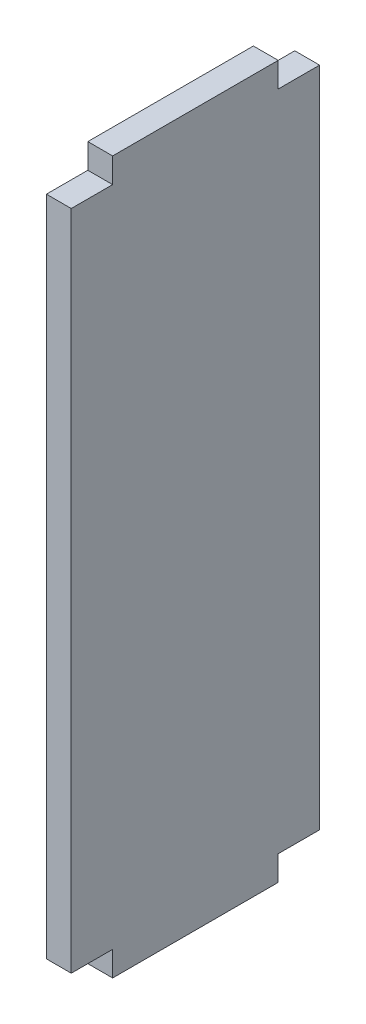
ISO-10303-21;
HEADER;
FILE_DESCRIPTION(('STEP AP214'),'2;1');
FILE_NAME('part.step','',(''),(''),'','','');
FILE_SCHEMA(('AUTOMOTIVE_DESIGN { 1 0 10303 214 1 1 1 1 }'));
ENDSEC;
DATA;
#1=APPLICATION_CONTEXT('core data for automotive mechanical design processes');
#2=APPLICATION_PROTOCOL_DEFINITION('international standard','automotive_design',2000,#1);
#3=PRODUCT_CONTEXT('',#1,'mechanical');
#4=PRODUCT('Part','Part','',(#3));
#5=PRODUCT_RELATED_PRODUCT_CATEGORY('part','',(#4));
#6=PRODUCT_DEFINITION_FORMATION('','',#4);
#7=PRODUCT_DEFINITION_CONTEXT('part definition',#1,'design');
#8=PRODUCT_DEFINITION('design','',#6,#7);
#9=PRODUCT_DEFINITION_SHAPE('','',#8);
#10=(LENGTH_UNIT() NAMED_UNIT(*) SI_UNIT(.MILLI.,.METRE.));
#11=(NAMED_UNIT(*) PLANE_ANGLE_UNIT() SI_UNIT($,.RADIAN.));
#12=(NAMED_UNIT(*) SI_UNIT($,.STERADIAN.) SOLID_ANGLE_UNIT());
#13=UNCERTAINTY_MEASURE_WITH_UNIT(LENGTH_MEASURE(1.E-05),#10,'distance_accuracy_value','');
#14=(GEOMETRIC_REPRESENTATION_CONTEXT(3) GLOBAL_UNCERTAINTY_ASSIGNED_CONTEXT((#13)) GLOBAL_UNIT_ASSIGNED_CONTEXT((#10,
#11,#12)) REPRESENTATION_CONTEXT('',''));
#15=CARTESIAN_POINT('',(0.,0.,0.));
#16=DIRECTION('',(0.,0.,1.));
#17=DIRECTION('',(1.,0.,0.));
#18=AXIS2_PLACEMENT_3D('',#15,#16,#17);
#19=CARTESIAN_POINT('',(-3.,0.,25.));
#20=DIRECTION('',(0.,1.,0.));
#21=DIRECTION('',(0.,0.,1.));
#22=AXIS2_PLACEMENT_3D('',#19,#20,#21);
#23=PLANE('',#22);
#24=DIRECTION('',(0.,0.,1.));
#25=VECTOR('',#24,1.);
#26=CARTESIAN_POINT('',(0.,0.,25.));
#27=LINE('',#26,#25);
#28=CARTESIAN_POINT('',(0.,0.,25.));
#29=VERTEX_POINT('',#28);
#30=CARTESIAN_POINT('',(0.,0.,30.));
#31=VERTEX_POINT('',#30);
#32=EDGE_CURVE('E142',#29,#31,#27,.T.);
#33=ORIENTED_EDGE('',*,*,#32,.T.);
#34=DIRECTION('',(1.,0.,0.));
#35=VECTOR('',#34,1.);
#36=CARTESIAN_POINT('',(-3.,0.,30.));
#37=LINE('',#36,#35);
#38=CARTESIAN_POINT('',(-3.,0.,30.));
#39=VERTEX_POINT('',#38);
#40=EDGE_CURVE('E10',#39,#31,#37,.T.);
#41=ORIENTED_EDGE('',*,*,#40,.F.);
#42=DIRECTION('',(0.,0.,1.));
#43=VECTOR('',#42,1.);
#44=CARTESIAN_POINT('',(-3.,0.,25.));
#45=LINE('',#44,#43);
#46=CARTESIAN_POINT('',(-3.,0.,25.));
#47=VERTEX_POINT('',#46);
#48=EDGE_CURVE('E136',#47,#39,#45,.T.);
#49=ORIENTED_EDGE('',*,*,#48,.F.);
#50=DIRECTION('',(1.,0.,0.));
#51=VECTOR('',#50,1.);
#52=CARTESIAN_POINT('',(-3.,0.,25.));
#53=LINE('',#52,#51);
#54=EDGE_CURVE('E132',#47,#29,#53,.T.);
#55=ORIENTED_EDGE('',*,*,#54,.T.);
#56=EDGE_LOOP('',(#33,#41,#49,#55));
#57=FACE_BOUND('',#56,.T.);
#58=ADVANCED_FACE('F16',(#57),#23,.F.);
#59=CARTESIAN_POINT('',(-3.,0.,30.));
#60=DIRECTION('',(0.,0.,-1.));
#61=DIRECTION('',(-1.,0.,0.));
#62=AXIS2_PLACEMENT_3D('',#59,#60,#61);
#63=PLANE('',#62);
#64=DIRECTION('',(0.,1.,0.));
#65=VECTOR('',#64,1.);
#66=CARTESIAN_POINT('',(0.,0.,30.));
#67=LINE('',#66,#65);
#68=CARTESIAN_POINT('',(0.,80.,30.));
#69=VERTEX_POINT('',#68);
#70=EDGE_CURVE('E138',#31,#69,#67,.T.);
#71=ORIENTED_EDGE('',*,*,#70,.T.);
#72=DIRECTION('',(1.,0.,0.));
#73=VECTOR('',#72,1.);
#74=CARTESIAN_POINT('',(-3.,80.,30.));
#75=LINE('',#74,#73);
#76=CARTESIAN_POINT('',(-3.,80.,30.));
#77=VERTEX_POINT('',#76);
#78=EDGE_CURVE('E24',#77,#69,#75,.T.);
#79=ORIENTED_EDGE('',*,*,#78,.F.);
#80=DIRECTION('',(0.,1.,0.));
#81=VECTOR('',#80,1.);
#82=CARTESIAN_POINT('',(-3.,0.,30.));
#83=LINE('',#82,#81);
#84=EDGE_CURVE('E87',#39,#77,#83,.T.);
#85=ORIENTED_EDGE('',*,*,#84,.F.);
#86=ORIENTED_EDGE('',*,*,#40,.T.);
#87=EDGE_LOOP('',(#71,#79,#85,#86));
#88=FACE_BOUND('',#87,.T.);
#89=ADVANCED_FACE('F250',(#88),#63,.F.);
#90=CARTESIAN_POINT('',(-3.,80.,30.));
#91=DIRECTION('',(0.,-1.,0.));
#92=DIRECTION('',(0.,0.,-1.));
#93=AXIS2_PLACEMENT_3D('',#90,#91,#92);
#94=PLANE('',#93);
#95=DIRECTION('',(0.,0.,-1.));
#96=VECTOR('',#95,1.);
#97=CARTESIAN_POINT('',(0.,80.,30.));
#98=LINE('',#97,#96);
#99=CARTESIAN_POINT('',(0.,80.,25.));
#100=VERTEX_POINT('',#99);
#101=EDGE_CURVE('E141',#69,#100,#98,.T.);
#102=ORIENTED_EDGE('',*,*,#101,.T.);
#103=DIRECTION('',(1.,0.,0.));
#104=VECTOR('',#103,1.);
#105=CARTESIAN_POINT('',(-3.,80.,25.));
#106=LINE('',#105,#104);
#107=CARTESIAN_POINT('',(-3.,80.,25.));
#108=VERTEX_POINT('',#107);
#109=EDGE_CURVE('E190',#108,#100,#106,.T.);
#110=ORIENTED_EDGE('',*,*,#109,.F.);
#111=DIRECTION('',(0.,0.,-1.));
#112=VECTOR('',#111,1.);
#113=CARTESIAN_POINT('',(-3.,80.,30.));
#114=LINE('',#113,#112);
#115=EDGE_CURVE('E198',#77,#108,#114,.T.);
#116=ORIENTED_EDGE('',*,*,#115,.F.);
#117=ORIENTED_EDGE('',*,*,#78,.T.);
#118=EDGE_LOOP('',(#102,#110,#116,#117));
#119=FACE_BOUND('',#118,.T.);
#120=ADVANCED_FACE('F196',(#119),#94,.F.);
#121=CARTESIAN_POINT('',(-3.,80.,25.));
#122=DIRECTION('',(0.,0.,-1.));
#123=DIRECTION('',(-1.,0.,0.));
#124=AXIS2_PLACEMENT_3D('',#121,#122,#123);
#125=PLANE('',#124);
#126=DIRECTION('',(0.,1.,0.));
#127=VECTOR('',#126,1.);
#128=CARTESIAN_POINT('',(0.,80.,25.));
#129=LINE('',#128,#127);
#130=CARTESIAN_POINT('',(0.,83.,25.));
#131=VERTEX_POINT('',#130);
#132=EDGE_CURVE('E145',#100,#131,#129,.T.);
#133=ORIENTED_EDGE('',*,*,#132,.T.);
#134=DIRECTION('',(1.,0.,0.));
#135=VECTOR('',#134,1.);
#136=CARTESIAN_POINT('',(-2.99999999999999,83.,25.));
#137=LINE('',#136,#135);
#138=CARTESIAN_POINT('',(-2.99999999999999,83.,25.));
#139=VERTEX_POINT('',#138);
#140=EDGE_CURVE('E187',#139,#131,#137,.T.);
#141=ORIENTED_EDGE('',*,*,#140,.F.);
#142=DIRECTION('',(0.,1.,0.));
#143=VECTOR('',#142,1.);
#144=CARTESIAN_POINT('',(-3.,80.,25.));
#145=LINE('',#144,#143);
#146=EDGE_CURVE('E216',#108,#139,#145,.T.);
#147=ORIENTED_EDGE('',*,*,#146,.F.);
#148=ORIENTED_EDGE('',*,*,#109,.T.);
#149=EDGE_LOOP('',(#133,#141,#147,#148));
#150=FACE_BOUND('',#149,.T.);
#151=ADVANCED_FACE('F207',(#150),#125,.F.);
#152=CARTESIAN_POINT('',(-2.99999999999999,83.,25.));
#153=DIRECTION('',(0.,-1.,0.));
#154=DIRECTION('',(0.,0.,-1.));
#155=AXIS2_PLACEMENT_3D('',#152,#153,#154);
#156=PLANE('',#155);
#157=DIRECTION('',(0.,0.,-1.));
#158=VECTOR('',#157,1.);
#159=CARTESIAN_POINT('',(0.,83.,25.));
#160=LINE('',#159,#158);
#161=CARTESIAN_POINT('',(0.,83.,5.00000000000002));
#162=VERTEX_POINT('',#161);
#163=EDGE_CURVE('E148',#131,#162,#160,.T.);
#164=ORIENTED_EDGE('',*,*,#163,.T.);
#165=DIRECTION('',(1.,0.,0.));
#166=VECTOR('',#165,1.);
#167=CARTESIAN_POINT('',(-2.99999999999999,83.,5.00000000000002));
#168=LINE('',#167,#166);
#169=CARTESIAN_POINT('',(-2.99999999999999,83.,5.00000000000002));
#170=VERTEX_POINT('',#169);
#171=EDGE_CURVE('E184',#170,#162,#168,.T.);
#172=ORIENTED_EDGE('',*,*,#171,.F.);
#173=DIRECTION('',(0.,0.,-1.));
#174=VECTOR('',#173,1.);
#175=CARTESIAN_POINT('',(-2.99999999999999,83.,25.));
#176=LINE('',#175,#174);
#177=EDGE_CURVE('E213',#139,#170,#176,.T.);
#178=ORIENTED_EDGE('',*,*,#177,.F.);
#179=ORIENTED_EDGE('',*,*,#140,.T.);
#180=EDGE_LOOP('',(#164,#172,#178,#179));
#181=FACE_BOUND('',#180,.T.);
#182=ADVANCED_FACE('F211',(#181),#156,.F.);
#183=CARTESIAN_POINT('',(-2.99999999999999,83.,5.00000000000002));
#184=DIRECTION('',(0.,0.,1.));
#185=DIRECTION('',(0.,-1.,0.));
#186=AXIS2_PLACEMENT_3D('',#183,#184,#185);
#187=PLANE('',#186);
#188=DIRECTION('',(0.,-1.,0.));
#189=VECTOR('',#188,1.);
#190=CARTESIAN_POINT('',(0.,83.,5.00000000000002));
#191=LINE('',#190,#189);
#192=CARTESIAN_POINT('',(0.,80.,5.00000000000002));
#193=VERTEX_POINT('',#192);
#194=EDGE_CURVE('E151',#162,#193,#191,.T.);
#195=ORIENTED_EDGE('',*,*,#194,.T.);
#196=DIRECTION('',(1.,0.,0.));
#197=VECTOR('',#196,1.);
#198=CARTESIAN_POINT('',(-3.,80.,5.00000000000002));
#199=LINE('',#198,#197);
#200=CARTESIAN_POINT('',(-3.,80.,5.00000000000002));
#201=VERTEX_POINT('',#200);
#202=EDGE_CURVE('E181',#201,#193,#199,.T.);
#203=ORIENTED_EDGE('',*,*,#202,.F.);
#204=DIRECTION('',(0.,-1.,0.));
#205=VECTOR('',#204,1.);
#206=CARTESIAN_POINT('',(-2.99999999999999,83.,5.00000000000002));
#207=LINE('',#206,#205);
#208=EDGE_CURVE('E215',#170,#201,#207,.T.);
#209=ORIENTED_EDGE('',*,*,#208,.F.);
#210=ORIENTED_EDGE('',*,*,#171,.T.);
#211=EDGE_LOOP('',(#195,#203,#209,#210));
#212=FACE_BOUND('',#211,.T.);
#213=ADVANCED_FACE('F263',(#212),#187,.F.);
#214=CARTESIAN_POINT('',(-3.,80.,5.00000000000002));
#215=DIRECTION('',(0.,-1.,0.));
#216=DIRECTION('',(0.,0.,-1.));
#217=AXIS2_PLACEMENT_3D('',#214,#215,#216);
#218=PLANE('',#217);
#219=DIRECTION('',(0.,0.,-1.));
#220=VECTOR('',#219,1.);
#221=CARTESIAN_POINT('',(0.,80.,5.00000000000002));
#222=LINE('',#221,#220);
#223=CARTESIAN_POINT('',(0.,80.,0.));
#224=VERTEX_POINT('',#223);
#225=EDGE_CURVE('E154',#193,#224,#222,.T.);
#226=ORIENTED_EDGE('',*,*,#225,.T.);
#227=DIRECTION('',(1.,0.,0.));
#228=VECTOR('',#227,1.);
#229=CARTESIAN_POINT('',(-3.,80.,0.));
#230=LINE('',#229,#228);
#231=CARTESIAN_POINT('',(-3.,80.,0.));
#232=VERTEX_POINT('',#231);
#233=EDGE_CURVE('E178',#232,#224,#230,.T.);
#234=ORIENTED_EDGE('',*,*,#233,.F.);
#235=DIRECTION('',(0.,0.,-1.));
#236=VECTOR('',#235,1.);
#237=CARTESIAN_POINT('',(-3.,80.,5.00000000000002));
#238=LINE('',#237,#236);
#239=EDGE_CURVE('E218',#201,#232,#238,.T.);
#240=ORIENTED_EDGE('',*,*,#239,.F.);
#241=ORIENTED_EDGE('',*,*,#202,.T.);
#242=EDGE_LOOP('',(#226,#234,#240,#241));
#243=FACE_BOUND('',#242,.T.);
#244=ADVANCED_FACE('F266',(#243),#218,.F.);
#245=CARTESIAN_POINT('',(-3.,80.,0.));
#246=DIRECTION('',(0.,0.,1.));
#247=DIRECTION('',(0.,-1.,0.));
#248=AXIS2_PLACEMENT_3D('',#245,#246,#247);
#249=PLANE('',#248);
#250=DIRECTION('',(0.,-1.,0.));
#251=VECTOR('',#250,1.);
#252=CARTESIAN_POINT('',(0.,80.,0.));
#253=LINE('',#252,#251);
#254=CARTESIAN_POINT('',(0.,0.,0.));
#255=VERTEX_POINT('',#254);
#256=EDGE_CURVE('E157',#224,#255,#253,.T.);
#257=ORIENTED_EDGE('',*,*,#256,.T.);
#258=DIRECTION('',(1.,0.,0.));
#259=VECTOR('',#258,1.);
#260=CARTESIAN_POINT('',(-3.,0.,0.));
#261=LINE('',#260,#259);
#262=CARTESIAN_POINT('',(-3.,0.,0.));
#263=VERTEX_POINT('',#262);
#264=EDGE_CURVE('E175',#263,#255,#261,.T.);
#265=ORIENTED_EDGE('',*,*,#264,.F.);
#266=DIRECTION('',(0.,-1.,0.));
#267=VECTOR('',#266,1.);
#268=CARTESIAN_POINT('',(-3.,80.,0.));
#269=LINE('',#268,#267);
#270=EDGE_CURVE('E224',#232,#263,#269,.T.);
#271=ORIENTED_EDGE('',*,*,#270,.F.);
#272=ORIENTED_EDGE('',*,*,#233,.T.);
#273=EDGE_LOOP('',(#257,#265,#271,#272));
#274=FACE_BOUND('',#273,.T.);
#275=ADVANCED_FACE('F230',(#274),#249,.F.);
#276=CARTESIAN_POINT('',(-3.,0.,0.));
#277=DIRECTION('',(0.,1.,0.));
#278=DIRECTION('',(0.,0.,1.));
#279=AXIS2_PLACEMENT_3D('',#276,#277,#278);
#280=PLANE('',#279);
#281=DIRECTION('',(0.,0.,1.));
#282=VECTOR('',#281,1.);
#283=CARTESIAN_POINT('',(0.,0.,0.));
#284=LINE('',#283,#282);
#285=CARTESIAN_POINT('',(0.,0.,5.));
#286=VERTEX_POINT('',#285);
#287=EDGE_CURVE('E160',#255,#286,#284,.T.);
#288=ORIENTED_EDGE('',*,*,#287,.T.);
#289=DIRECTION('',(1.,0.,0.));
#290=VECTOR('',#289,1.);
#291=CARTESIAN_POINT('',(-3.,0.,5.));
#292=LINE('',#291,#290);
#293=CARTESIAN_POINT('',(-3.,0.,5.));
#294=VERTEX_POINT('',#293);
#295=EDGE_CURVE('E127',#294,#286,#292,.T.);
#296=ORIENTED_EDGE('',*,*,#295,.F.);
#297=DIRECTION('',(0.,0.,1.));
#298=VECTOR('',#297,1.);
#299=CARTESIAN_POINT('',(-3.,0.,0.));
#300=LINE('',#299,#298);
#301=EDGE_CURVE('E118',#263,#294,#300,.T.);
#302=ORIENTED_EDGE('',*,*,#301,.F.);
#303=ORIENTED_EDGE('',*,*,#264,.T.);
#304=EDGE_LOOP('',(#288,#296,#302,#303));
#305=FACE_BOUND('',#304,.T.);
#306=ADVANCED_FACE('F234',(#305),#280,.F.);
#307=CARTESIAN_POINT('',(-3.,0.,5.));
#308=DIRECTION('',(0.,0.,1.));
#309=DIRECTION('',(1.,0.,0.));
#310=AXIS2_PLACEMENT_3D('',#307,#308,#309);
#311=PLANE('',#310);
#312=DIRECTION('',(0.,-1.,0.));
#313=VECTOR('',#312,1.);
#314=CARTESIAN_POINT('',(0.,0.,5.));
#315=LINE('',#314,#313);
#316=CARTESIAN_POINT('',(0.,-3.,5.));
#317=VERTEX_POINT('',#316);
#318=EDGE_CURVE('E126',#286,#317,#315,.T.);
#319=ORIENTED_EDGE('',*,*,#318,.T.);
#320=DIRECTION('',(1.,0.,0.));
#321=VECTOR('',#320,1.);
#322=CARTESIAN_POINT('',(-3.,-3.,5.));
#323=LINE('',#322,#321);
#324=CARTESIAN_POINT('',(-3.,-3.,5.));
#325=VERTEX_POINT('',#324);
#326=EDGE_CURVE('E123',#325,#317,#323,.T.);
#327=ORIENTED_EDGE('',*,*,#326,.F.);
#328=DIRECTION('',(0.,-1.,0.));
#329=VECTOR('',#328,1.);
#330=CARTESIAN_POINT('',(-3.,0.,5.));
#331=LINE('',#330,#329);
#332=EDGE_CURVE('E112',#294,#325,#331,.T.);
#333=ORIENTED_EDGE('',*,*,#332,.F.);
#334=ORIENTED_EDGE('',*,*,#295,.T.);
#335=EDGE_LOOP('',(#319,#327,#333,#334));
#336=FACE_BOUND('',#335,.T.);
#337=ADVANCED_FACE('F124',(#336),#311,.F.);
#338=CARTESIAN_POINT('',(-3.,-3.,5.));
#339=DIRECTION('',(0.,1.,0.));
#340=DIRECTION('',(0.,0.,1.));
#341=AXIS2_PLACEMENT_3D('',#338,#339,#340);
#342=PLANE('',#341);
#343=DIRECTION('',(0.,0.,1.));
#344=VECTOR('',#343,1.);
#345=CARTESIAN_POINT('',(0.,-3.,5.));
#346=LINE('',#345,#344);
#347=CARTESIAN_POINT('',(0.,-3.,25.));
#348=VERTEX_POINT('',#347);
#349=EDGE_CURVE('E73',#317,#348,#346,.T.);
#350=ORIENTED_EDGE('',*,*,#349,.T.);
#351=DIRECTION('',(1.,0.,0.));
#352=VECTOR('',#351,1.);
#353=CARTESIAN_POINT('',(-3.,-3.,25.));
#354=LINE('',#353,#352);
#355=CARTESIAN_POINT('',(-3.,-3.,25.));
#356=VERTEX_POINT('',#355);
#357=EDGE_CURVE('E128',#356,#348,#354,.T.);
#358=ORIENTED_EDGE('',*,*,#357,.F.);
#359=DIRECTION('',(0.,0.,1.));
#360=VECTOR('',#359,1.);
#361=CARTESIAN_POINT('',(-3.,-3.,5.));
#362=LINE('',#361,#360);
#363=EDGE_CURVE('E116',#325,#356,#362,.T.);
#364=ORIENTED_EDGE('',*,*,#363,.F.);
#365=ORIENTED_EDGE('',*,*,#326,.T.);
#366=EDGE_LOOP('',(#350,#358,#364,#365));
#367=FACE_BOUND('',#366,.T.);
#368=ADVANCED_FACE('F130',(#367),#342,.F.);
#369=CARTESIAN_POINT('',(-3.,-3.,25.));
#370=DIRECTION('',(0.,0.,-1.));
#371=DIRECTION('',(-1.,0.,0.));
#372=AXIS2_PLACEMENT_3D('',#369,#370,#371);
#373=PLANE('',#372);
#374=DIRECTION('',(0.,1.,0.));
#375=VECTOR('',#374,1.);
#376=CARTESIAN_POINT('',(0.,-3.,25.));
#377=LINE('',#376,#375);
#378=EDGE_CURVE('E79',#348,#29,#377,.T.);
#379=ORIENTED_EDGE('',*,*,#378,.T.);
#380=ORIENTED_EDGE('',*,*,#54,.F.);
#381=DIRECTION('',(0.,1.,0.));
#382=VECTOR('',#381,1.);
#383=CARTESIAN_POINT('',(-3.,-3.,25.));
#384=LINE('',#383,#382);
#385=EDGE_CURVE('E32',#356,#47,#384,.T.);
#386=ORIENTED_EDGE('',*,*,#385,.F.);
#387=ORIENTED_EDGE('',*,*,#357,.T.);
#388=EDGE_LOOP('',(#379,#380,#386,#387));
#389=FACE_BOUND('',#388,.T.);
#390=ADVANCED_FACE('F238',(#389),#373,.F.);
#391=CARTESIAN_POINT('',(-3.,0.,0.));
#392=DIRECTION('',(-1.,0.,0.));
#393=DIRECTION('',(0.,-1.,0.));
#394=AXIS2_PLACEMENT_3D('',#391,#392,#393);
#395=PLANE('',#394);
#396=ORIENTED_EDGE('',*,*,#48,.T.);
#397=ORIENTED_EDGE('',*,*,#84,.T.);
#398=ORIENTED_EDGE('',*,*,#115,.T.);
#399=ORIENTED_EDGE('',*,*,#146,.T.);
#400=ORIENTED_EDGE('',*,*,#177,.T.);
#401=ORIENTED_EDGE('',*,*,#208,.T.);
#402=ORIENTED_EDGE('',*,*,#239,.T.);
#403=ORIENTED_EDGE('',*,*,#270,.T.);
#404=ORIENTED_EDGE('',*,*,#301,.T.);
#405=ORIENTED_EDGE('',*,*,#332,.T.);
#406=ORIENTED_EDGE('',*,*,#363,.T.);
#407=ORIENTED_EDGE('',*,*,#385,.T.);
#408=EDGE_LOOP('',(#396,#397,#398,#399,#400,#401,#402,#403,#404,#405,#406,#407));
#409=FACE_BOUND('',#408,.T.);
#410=ADVANCED_FACE('F114',(#409),#395,.T.);
#411=CARTESIAN_POINT('',(0.,0.,0.));
#412=DIRECTION('',(-1.,0.,0.));
#413=DIRECTION('',(0.,-1.,0.));
#414=AXIS2_PLACEMENT_3D('',#411,#412,#413);
#415=PLANE('',#414);
#416=ORIENTED_EDGE('',*,*,#32,.F.);
#417=ORIENTED_EDGE('',*,*,#378,.F.);
#418=ORIENTED_EDGE('',*,*,#349,.F.);
#419=ORIENTED_EDGE('',*,*,#318,.F.);
#420=ORIENTED_EDGE('',*,*,#287,.F.);
#421=ORIENTED_EDGE('',*,*,#256,.F.);
#422=ORIENTED_EDGE('',*,*,#225,.F.);
#423=ORIENTED_EDGE('',*,*,#194,.F.);
#424=ORIENTED_EDGE('',*,*,#163,.F.);
#425=ORIENTED_EDGE('',*,*,#132,.F.);
#426=ORIENTED_EDGE('',*,*,#101,.F.);
#427=ORIENTED_EDGE('',*,*,#70,.F.);
#428=EDGE_LOOP('',(#416,#417,#418,#419,#420,#421,#422,#423,#424,#425,#426,#427));
#429=FACE_BOUND('',#428,.T.);
#430=ADVANCED_FACE('F202',(#429),#415,.F.);
#431=CLOSED_SHELL('',(#58,#89,#120,#151,#182,#213,#244,#275,#306,#337,#368,#390,#410,#430));
#432=MANIFOLD_SOLID_BREP('B1',#431);
#433=ADVANCED_BREP_SHAPE_REPRESENTATION('',(#18,#432),#14);
#434=SHAPE_DEFINITION_REPRESENTATION(#9,#433);
ENDSEC;
END-ISO-10303-21;
